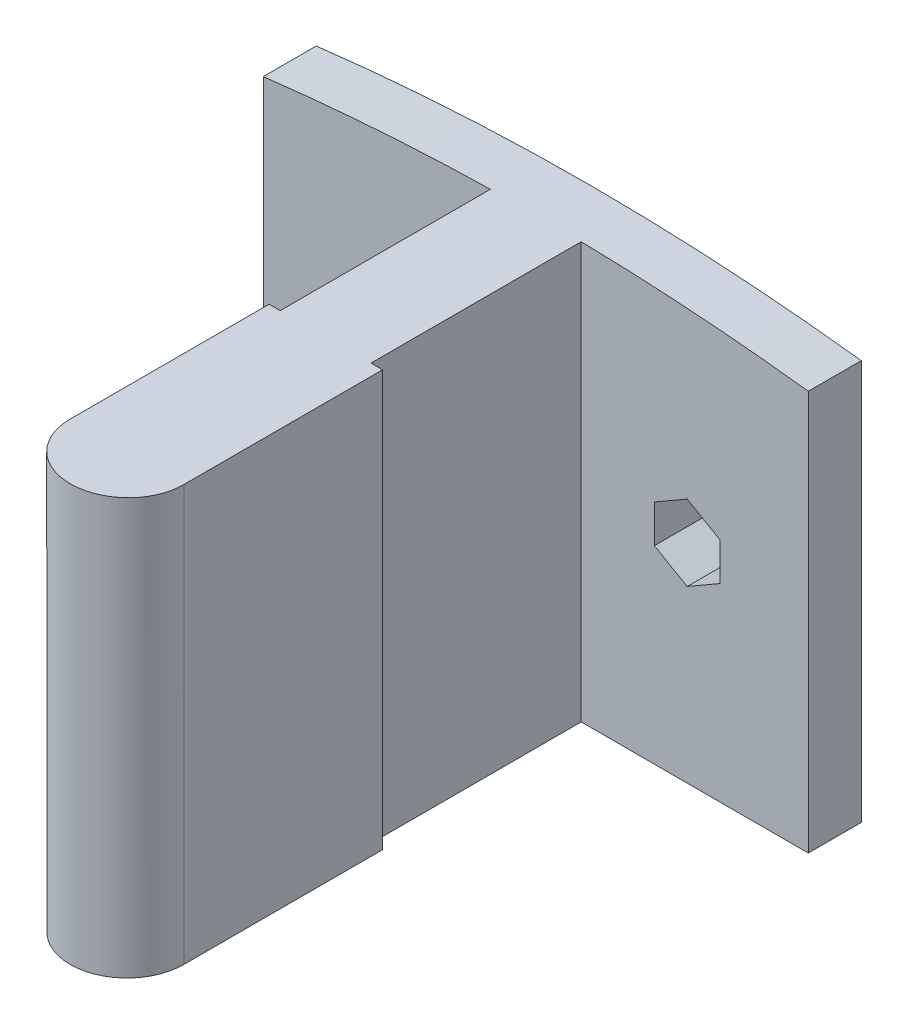
ISO-10303-21;
HEADER;
FILE_DESCRIPTION(('STEP AP214'),'2;1');
FILE_NAME('part.step','',(''),(''),'','','');
FILE_SCHEMA(('AUTOMOTIVE_DESIGN { 1 0 10303 214 1 1 1 1 }'));
ENDSEC;
DATA;
#1=APPLICATION_CONTEXT('core data for automotive mechanical design processes');
#2=APPLICATION_PROTOCOL_DEFINITION('international standard','automotive_design',2000,#1);
#3=PRODUCT_CONTEXT('',#1,'mechanical');
#4=PRODUCT('Part','Part','',(#3));
#5=PRODUCT_RELATED_PRODUCT_CATEGORY('part','',(#4));
#6=PRODUCT_DEFINITION_FORMATION('','',#4);
#7=PRODUCT_DEFINITION_CONTEXT('part definition',#1,'design');
#8=PRODUCT_DEFINITION('design','',#6,#7);
#9=PRODUCT_DEFINITION_SHAPE('','',#8);
#10=(LENGTH_UNIT() NAMED_UNIT(*) SI_UNIT(.MILLI.,.METRE.));
#11=(NAMED_UNIT(*) PLANE_ANGLE_UNIT() SI_UNIT($,.RADIAN.));
#12=(NAMED_UNIT(*) SI_UNIT($,.STERADIAN.) SOLID_ANGLE_UNIT());
#13=UNCERTAINTY_MEASURE_WITH_UNIT(LENGTH_MEASURE(1.E-05),#10,'distance_accuracy_value','');
#14=(GEOMETRIC_REPRESENTATION_CONTEXT(3) GLOBAL_UNCERTAINTY_ASSIGNED_CONTEXT((#13)) GLOBAL_UNIT_ASSIGNED_CONTEXT((#10,
#11,#12)) REPRESENTATION_CONTEXT('',''));
#15=CARTESIAN_POINT('',(0.,0.,0.));
#16=DIRECTION('',(0.,0.,1.));
#17=DIRECTION('',(1.,0.,0.));
#18=AXIS2_PLACEMENT_3D('',#15,#16,#17);
#19=CARTESIAN_POINT('',(-2.5,6.5,-14.));
#20=DIRECTION('',(-0.5,0.866025403784439,0.));
#21=DIRECTION('',(-0.866025403784439,-0.5,0.));
#22=AXIS2_PLACEMENT_3D('',#19,#20,#21);
#23=PLANE('',#22);
#24=DIRECTION('',(0.,0.,1.));
#25=VECTOR('',#24,1.);
#26=CARTESIAN_POINT('',(-2.5,6.5,-14.));
#27=LINE('',#26,#25);
#28=CARTESIAN_POINT('',(-2.5,6.5,-13.7));
#29=VERTEX_POINT('',#28);
#30=CARTESIAN_POINT('',(-2.5,6.5,-12.3));
#31=VERTEX_POINT('',#30);
#32=EDGE_CURVE('E392',#29,#31,#27,.T.);
#33=ORIENTED_EDGE('',*,*,#32,.T.);
#34=DIRECTION('',(-0.866025403784439,-0.5,0.));
#35=VECTOR('',#34,1.);
#36=CARTESIAN_POINT('',(-2.5,6.5,-12.3));
#37=LINE('',#36,#35);
#38=CARTESIAN_POINT('',(-3.36602540378444,6.,-12.3));
#39=VERTEX_POINT('',#38);
#40=EDGE_CURVE('E495',#31,#39,#37,.T.);
#41=ORIENTED_EDGE('',*,*,#40,.T.);
#42=DIRECTION('',(0.,0.,1.));
#43=VECTOR('',#42,1.);
#44=CARTESIAN_POINT('',(-3.36602540378444,6.,-14.));
#45=LINE('',#44,#43);
#46=CARTESIAN_POINT('',(-3.36602540378444,6.,-13.7));
#47=VERTEX_POINT('',#46);
#48=EDGE_CURVE('E395',#47,#39,#45,.T.);
#49=ORIENTED_EDGE('',*,*,#48,.F.);
#50=DIRECTION('',(0.866025403784439,0.5,0.));
#51=VECTOR('',#50,1.);
#52=CARTESIAN_POINT('',(-2.5,6.5,-13.7));
#53=LINE('',#52,#51);
#54=EDGE_CURVE('E499',#47,#29,#53,.T.);
#55=ORIENTED_EDGE('',*,*,#54,.T.);
#56=EDGE_LOOP('',(#33,#41,#49,#55));
#57=FACE_BOUND('',#56,.T.);
#58=ADVANCED_FACE('F75',(#57),#23,.F.);
#59=CARTESIAN_POINT('',(-3.36602540378444,6.,-14.));
#60=DIRECTION('',(-1.,0.,0.));
#61=DIRECTION('',(0.,0.,1.));
#62=AXIS2_PLACEMENT_3D('',#59,#60,#61);
#63=PLANE('',#62);
#64=ORIENTED_EDGE('',*,*,#48,.T.);
#65=DIRECTION('',(0.,-1.,0.));
#66=VECTOR('',#65,1.);
#67=CARTESIAN_POINT('',(-3.36602540378444,6.,-12.3));
#68=LINE('',#67,#66);
#69=CARTESIAN_POINT('',(-3.36602540378444,5.,-12.3));
#70=VERTEX_POINT('',#69);
#71=EDGE_CURVE('E330',#39,#70,#68,.T.);
#72=ORIENTED_EDGE('',*,*,#71,.T.);
#73=DIRECTION('',(0.,0.,1.));
#74=VECTOR('',#73,1.);
#75=CARTESIAN_POINT('',(-3.36602540378444,5.,-14.));
#76=LINE('',#75,#74);
#77=CARTESIAN_POINT('',(-3.36602540378444,5.,-13.7));
#78=VERTEX_POINT('',#77);
#79=EDGE_CURVE('E398',#78,#70,#76,.T.);
#80=ORIENTED_EDGE('',*,*,#79,.F.);
#81=DIRECTION('',(0.,1.,0.));
#82=VECTOR('',#81,1.);
#83=CARTESIAN_POINT('',(-3.36602540378444,6.,-13.7));
#84=LINE('',#83,#82);
#85=EDGE_CURVE('E282',#78,#47,#84,.T.);
#86=ORIENTED_EDGE('',*,*,#85,.T.);
#87=EDGE_LOOP('',(#64,#72,#80,#86));
#88=FACE_BOUND('',#87,.T.);
#89=ADVANCED_FACE('F471',(#88),#63,.F.);
#90=CARTESIAN_POINT('',(-3.36602540378444,5.,-14.));
#91=DIRECTION('',(-0.5,-0.866025403784439,0.));
#92=DIRECTION('',(0.866025403784439,-0.5,0.));
#93=AXIS2_PLACEMENT_3D('',#90,#91,#92);
#94=PLANE('',#93);
#95=ORIENTED_EDGE('',*,*,#79,.T.);
#96=DIRECTION('',(0.866025403784439,-0.5,0.));
#97=VECTOR('',#96,1.);
#98=CARTESIAN_POINT('',(-3.36602540378444,5.,-12.3));
#99=LINE('',#98,#97);
#100=CARTESIAN_POINT('',(-2.5,4.5,-12.3));
#101=VERTEX_POINT('',#100);
#102=EDGE_CURVE('E333',#70,#101,#99,.T.);
#103=ORIENTED_EDGE('',*,*,#102,.T.);
#104=DIRECTION('',(0.,0.,1.));
#105=VECTOR('',#104,1.);
#106=CARTESIAN_POINT('',(-2.5,4.5,-14.));
#107=LINE('',#106,#105);
#108=CARTESIAN_POINT('',(-2.5,4.5,-13.7));
#109=VERTEX_POINT('',#108);
#110=EDGE_CURVE('E401',#109,#101,#107,.T.);
#111=ORIENTED_EDGE('',*,*,#110,.F.);
#112=DIRECTION('',(-0.866025403784439,0.5,0.));
#113=VECTOR('',#112,1.);
#114=CARTESIAN_POINT('',(-3.36602540378444,5.,-13.7));
#115=LINE('',#114,#113);
#116=EDGE_CURVE('E301',#109,#78,#115,.T.);
#117=ORIENTED_EDGE('',*,*,#116,.T.);
#118=EDGE_LOOP('',(#95,#103,#111,#117));
#119=FACE_BOUND('',#118,.T.);
#120=ADVANCED_FACE('F475',(#119),#94,.F.);
#121=CARTESIAN_POINT('',(-2.5,4.5,-14.));
#122=DIRECTION('',(0.5,-0.866025403784439,0.));
#123=DIRECTION('',(0.866025403784439,0.5,0.));
#124=AXIS2_PLACEMENT_3D('',#121,#122,#123);
#125=PLANE('',#124);
#126=ORIENTED_EDGE('',*,*,#110,.T.);
#127=DIRECTION('',(0.866025403784439,0.5,0.));
#128=VECTOR('',#127,1.);
#129=CARTESIAN_POINT('',(-2.5,4.5,-12.3));
#130=LINE('',#129,#128);
#131=CARTESIAN_POINT('',(-1.63397459621556,5.,-12.3));
#132=VERTEX_POINT('',#131);
#133=EDGE_CURVE('E336',#101,#132,#130,.T.);
#134=ORIENTED_EDGE('',*,*,#133,.T.);
#135=DIRECTION('',(0.,0.,1.));
#136=VECTOR('',#135,1.);
#137=CARTESIAN_POINT('',(-1.63397459621556,5.,-14.));
#138=LINE('',#137,#136);
#139=CARTESIAN_POINT('',(-1.63397459621556,5.,-13.7));
#140=VERTEX_POINT('',#139);
#141=EDGE_CURVE('E404',#140,#132,#138,.T.);
#142=ORIENTED_EDGE('',*,*,#141,.F.);
#143=DIRECTION('',(-0.866025403784439,-0.5,0.));
#144=VECTOR('',#143,1.);
#145=CARTESIAN_POINT('',(-2.5,4.5,-13.7));
#146=LINE('',#145,#144);
#147=EDGE_CURVE('E304',#140,#109,#146,.T.);
#148=ORIENTED_EDGE('',*,*,#147,.T.);
#149=EDGE_LOOP('',(#126,#134,#142,#148));
#150=FACE_BOUND('',#149,.T.);
#151=ADVANCED_FACE('F479',(#150),#125,.F.);
#152=CARTESIAN_POINT('',(-1.63397459621556,5.,-14.));
#153=DIRECTION('',(1.,0.,0.));
#154=DIRECTION('',(0.,1.,0.));
#155=AXIS2_PLACEMENT_3D('',#152,#153,#154);
#156=PLANE('',#155);
#157=ORIENTED_EDGE('',*,*,#141,.T.);
#158=DIRECTION('',(0.,1.,0.));
#159=VECTOR('',#158,1.);
#160=CARTESIAN_POINT('',(-1.63397459621556,5.,-12.3));
#161=LINE('',#160,#159);
#162=CARTESIAN_POINT('',(-1.63397459621556,6.,-12.3));
#163=VERTEX_POINT('',#162);
#164=EDGE_CURVE('E339',#132,#163,#161,.T.);
#165=ORIENTED_EDGE('',*,*,#164,.T.);
#166=DIRECTION('',(0.,0.,1.));
#167=VECTOR('',#166,1.);
#168=CARTESIAN_POINT('',(-1.63397459621556,6.,-14.));
#169=LINE('',#168,#167);
#170=CARTESIAN_POINT('',(-1.63397459621556,6.,-13.7));
#171=VERTEX_POINT('',#170);
#172=EDGE_CURVE('E372',#171,#163,#169,.T.);
#173=ORIENTED_EDGE('',*,*,#172,.F.);
#174=DIRECTION('',(0.,-1.,0.));
#175=VECTOR('',#174,1.);
#176=CARTESIAN_POINT('',(-1.63397459621556,5.,-13.7));
#177=LINE('',#176,#175);
#178=EDGE_CURVE('E307',#171,#140,#177,.T.);
#179=ORIENTED_EDGE('',*,*,#178,.T.);
#180=EDGE_LOOP('',(#157,#165,#173,#179));
#181=FACE_BOUND('',#180,.T.);
#182=ADVANCED_FACE('F467',(#181),#156,.F.);
#183=CARTESIAN_POINT('',(-1.63397459621556,6.,-14.));
#184=DIRECTION('',(0.5,0.866025403784439,0.));
#185=DIRECTION('',(-0.866025403784439,0.5,0.));
#186=AXIS2_PLACEMENT_3D('',#183,#184,#185);
#187=PLANE('',#186);
#188=ORIENTED_EDGE('',*,*,#172,.T.);
#189=DIRECTION('',(-0.866025403784439,0.5,0.));
#190=VECTOR('',#189,1.);
#191=CARTESIAN_POINT('',(-1.63397459621556,6.,-12.3));
#192=LINE('',#191,#190);
#193=EDGE_CURVE('E342',#163,#31,#192,.T.);
#194=ORIENTED_EDGE('',*,*,#193,.T.);
#195=ORIENTED_EDGE('',*,*,#32,.F.);
#196=DIRECTION('',(0.866025403784439,-0.5,0.));
#197=VECTOR('',#196,1.);
#198=CARTESIAN_POINT('',(-1.63397459621556,6.,-13.7));
#199=LINE('',#198,#197);
#200=EDGE_CURVE('E310',#29,#171,#199,.T.);
#201=ORIENTED_EDGE('',*,*,#200,.T.);
#202=EDGE_LOOP('',(#188,#194,#195,#201));
#203=FACE_BOUND('',#202,.T.);
#204=ADVANCED_FACE('F464',(#203),#187,.F.);
#205=CARTESIAN_POINT('',(8.7,11.,-12.3));
#206=DIRECTION('',(0.,0.,-1.));
#207=DIRECTION('',(-1.,0.,0.));
#208=AXIS2_PLACEMENT_3D('',#205,#206,#207);
#209=PLANE('',#208);
#210=CARTESIAN_POINT('',(1.5,-49.,-12.3));
#211=DIRECTION('',(0.,0.,-1.));
#212=DIRECTION('',(-1.,0.,0.));
#213=AXIS2_PLACEMENT_3D('',#210,#211,#212);
#214=CIRCLE('',#213,60.);
#215=CARTESIAN_POINT('',(8.7,10.5664335007561,-12.3));
#216=VERTEX_POINT('',#215);
#217=CARTESIAN_POINT('',(2.7,10.9879987997599,-12.3));
#218=VERTEX_POINT('',#217);
#219=EDGE_CURVE('E245',#216,#218,#214,.F.);
#220=ORIENTED_EDGE('',*,*,#219,.T.);
#221=DIRECTION('',(0.,-1.,0.));
#222=VECTOR('',#221,1.);
#223=CARTESIAN_POINT('',(2.7,11.,-12.3));
#224=LINE('',#223,#222);
#225=CARTESIAN_POINT('',(2.7,0.,-12.3));
#226=VERTEX_POINT('',#225);
#227=EDGE_CURVE('E236',#218,#226,#224,.T.);
#228=ORIENTED_EDGE('',*,*,#227,.T.);
#229=DIRECTION('',(1.,0.,0.));
#230=VECTOR('',#229,1.);
#231=CARTESIAN_POINT('',(8.7,0.,-12.3));
#232=LINE('',#231,#230);
#233=CARTESIAN_POINT('',(8.7,0.,-12.3));
#234=VERTEX_POINT('',#233);
#235=EDGE_CURVE('E242',#226,#234,#232,.T.);
#236=ORIENTED_EDGE('',*,*,#235,.T.);
#237=DIRECTION('',(0.,-1.,0.));
#238=VECTOR('',#237,1.);
#239=CARTESIAN_POINT('',(8.7,11.,-12.3));
#240=LINE('',#239,#238);
#241=EDGE_CURVE('E248',#216,#234,#240,.T.);
#242=ORIENTED_EDGE('',*,*,#241,.F.);
#243=EDGE_LOOP('',(#220,#228,#236,#242));
#244=FACE_BOUND('',#243,.T.);
#245=DIRECTION('',(0.,1.,0.));
#246=VECTOR('',#245,1.);
#247=CARTESIAN_POINT('',(6.36602540378444,5.,-12.3));
#248=LINE('',#247,#246);
#249=CARTESIAN_POINT('',(6.36602540378444,5.,-12.3));
#250=VERTEX_POINT('',#249);
#251=CARTESIAN_POINT('',(6.36602540378444,6.,-12.3));
#252=VERTEX_POINT('',#251);
#253=EDGE_CURVE('E356',#250,#252,#248,.T.);
#254=ORIENTED_EDGE('',*,*,#253,.F.);
#255=DIRECTION('',(0.866025403784438,0.500000000000001,0.));
#256=VECTOR('',#255,1.);
#257=CARTESIAN_POINT('',(5.5,4.5,-12.3));
#258=LINE('',#257,#256);
#259=CARTESIAN_POINT('',(5.5,4.5,-12.3));
#260=VERTEX_POINT('',#259);
#261=EDGE_CURVE('E353',#260,#250,#258,.T.);
#262=ORIENTED_EDGE('',*,*,#261,.F.);
#263=DIRECTION('',(0.866025403784438,-0.500000000000001,0.));
#264=VECTOR('',#263,1.);
#265=CARTESIAN_POINT('',(4.63397459621557,5.,-12.3));
#266=LINE('',#265,#264);
#267=CARTESIAN_POINT('',(4.63397459621557,5.,-12.3));
#268=VERTEX_POINT('',#267);
#269=EDGE_CURVE('E350',#268,#260,#266,.T.);
#270=ORIENTED_EDGE('',*,*,#269,.F.);
#271=DIRECTION('',(0.,-1.,0.));
#272=VECTOR('',#271,1.);
#273=CARTESIAN_POINT('',(4.63397459621557,6.,-12.3));
#274=LINE('',#273,#272);
#275=CARTESIAN_POINT('',(4.63397459621557,6.,-12.3));
#276=VERTEX_POINT('',#275);
#277=EDGE_CURVE('E347',#276,#268,#274,.T.);
#278=ORIENTED_EDGE('',*,*,#277,.F.);
#279=DIRECTION('',(-0.866025403784438,-0.500000000000001,0.));
#280=VECTOR('',#279,1.);
#281=CARTESIAN_POINT('',(5.5,6.5,-12.3));
#282=LINE('',#281,#280);
#283=CARTESIAN_POINT('',(5.5,6.5,-12.3));
#284=VERTEX_POINT('',#283);
#285=EDGE_CURVE('E498',#284,#276,#282,.T.);
#286=ORIENTED_EDGE('',*,*,#285,.F.);
#287=DIRECTION('',(-0.866025403784439,0.5,0.));
#288=VECTOR('',#287,1.);
#289=CARTESIAN_POINT('',(6.36602540378444,6.,-12.3));
#290=LINE('',#289,#288);
#291=EDGE_CURVE('E359',#252,#284,#290,.T.);
#292=ORIENTED_EDGE('',*,*,#291,.F.);
#293=EDGE_LOOP('',(#254,#262,#270,#278,#286,#292));
#294=FACE_BOUND('',#293,.T.);
#295=ADVANCED_FACE('F238',(#244,#294),#209,.F.);
#296=CARTESIAN_POINT('',(0.3,11.,-12.3));
#297=DIRECTION('',(0.,0.,-1.));
#298=DIRECTION('',(-1.,0.,0.));
#299=AXIS2_PLACEMENT_3D('',#296,#297,#298);
#300=PLANE('',#299);
#301=CARTESIAN_POINT('',(1.5,-49.,-12.3));
#302=DIRECTION('',(0.,0.,-1.));
#303=DIRECTION('',(-1.,0.,0.));
#304=AXIS2_PLACEMENT_3D('',#301,#302,#303);
#305=CIRCLE('',#304,60.);
#306=CARTESIAN_POINT('',(0.3,10.9879987997599,-12.3));
#307=VERTEX_POINT('',#306);
#308=CARTESIAN_POINT('',(-5.7,10.5664335007561,-12.3));
#309=VERTEX_POINT('',#308);
#310=EDGE_CURVE('E345',#307,#309,#305,.F.);
#311=ORIENTED_EDGE('',*,*,#310,.T.);
#312=DIRECTION('',(0.,-1.,0.));
#313=VECTOR('',#312,1.);
#314=CARTESIAN_POINT('',(-5.7,11.,-12.3));
#315=LINE('',#314,#313);
#316=CARTESIAN_POINT('',(-5.7,0.,-12.3));
#317=VERTEX_POINT('',#316);
#318=EDGE_CURVE('E292',#309,#317,#315,.T.);
#319=ORIENTED_EDGE('',*,*,#318,.T.);
#320=DIRECTION('',(1.,0.,0.));
#321=VECTOR('',#320,1.);
#322=CARTESIAN_POINT('',(0.3,0.,-12.3));
#323=LINE('',#322,#321);
#324=CARTESIAN_POINT('',(0.3,0.,-12.3));
#325=VERTEX_POINT('',#324);
#326=EDGE_CURVE('E272',#317,#325,#323,.T.);
#327=ORIENTED_EDGE('',*,*,#326,.T.);
#328=DIRECTION('',(0.,-1.,0.));
#329=VECTOR('',#328,1.);
#330=CARTESIAN_POINT('',(0.3,11.,-12.3));
#331=LINE('',#330,#329);
#332=EDGE_CURVE('E290',#307,#325,#331,.T.);
#333=ORIENTED_EDGE('',*,*,#332,.F.);
#334=EDGE_LOOP('',(#311,#319,#327,#333));
#335=FACE_BOUND('',#334,.T.);
#336=ORIENTED_EDGE('',*,*,#164,.F.);
#337=ORIENTED_EDGE('',*,*,#133,.F.);
#338=ORIENTED_EDGE('',*,*,#102,.F.);
#339=ORIENTED_EDGE('',*,*,#71,.F.);
#340=ORIENTED_EDGE('',*,*,#40,.F.);
#341=ORIENTED_EDGE('',*,*,#193,.F.);
#342=EDGE_LOOP('',(#336,#337,#338,#339,#340,#341));
#343=FACE_BOUND('',#342,.T.);
#344=ADVANCED_FACE('F491',(#335,#343),#300,.F.);
#345=CARTESIAN_POINT('',(-5.7,11.,-13.7));
#346=DIRECTION('',(0.,0.,1.));
#347=DIRECTION('',(1.,0.,0.));
#348=AXIS2_PLACEMENT_3D('',#345,#346,#347);
#349=PLANE('',#348);
#350=CARTESIAN_POINT('',(1.5,-49.,-13.7));
#351=DIRECTION('',(0.,0.,1.));
#352=DIRECTION('',(1.,0.,0.));
#353=AXIS2_PLACEMENT_3D('',#350,#351,#352);
#354=CIRCLE('',#353,60.);
#355=CARTESIAN_POINT('',(-5.7,10.5664335007561,-13.7));
#356=VERTEX_POINT('',#355);
#357=CARTESIAN_POINT('',(8.7,10.5664335007561,-13.7));
#358=VERTEX_POINT('',#357);
#359=EDGE_CURVE('E328',#356,#358,#354,.F.);
#360=ORIENTED_EDGE('',*,*,#359,.T.);
#361=DIRECTION('',(0.,-1.,0.));
#362=VECTOR('',#361,1.);
#363=CARTESIAN_POINT('',(8.7,11.,-13.7));
#364=LINE('',#363,#362);
#365=CARTESIAN_POINT('',(8.7,0.,-13.7));
#366=VERTEX_POINT('',#365);
#367=EDGE_CURVE('E296',#358,#366,#364,.T.);
#368=ORIENTED_EDGE('',*,*,#367,.T.);
#369=DIRECTION('',(-1.,0.,0.));
#370=VECTOR('',#369,1.);
#371=CARTESIAN_POINT('',(-5.7,0.,-13.7));
#372=LINE('',#371,#370);
#373=CARTESIAN_POINT('',(-5.7,0.,-13.7));
#374=VERTEX_POINT('',#373);
#375=EDGE_CURVE('E264',#366,#374,#372,.T.);
#376=ORIENTED_EDGE('',*,*,#375,.T.);
#377=DIRECTION('',(0.,-1.,0.));
#378=VECTOR('',#377,1.);
#379=CARTESIAN_POINT('',(-5.7,11.,-13.7));
#380=LINE('',#379,#378);
#381=EDGE_CURVE('E294',#356,#374,#380,.T.);
#382=ORIENTED_EDGE('',*,*,#381,.F.);
#383=EDGE_LOOP('',(#360,#368,#376,#382));
#384=FACE_BOUND('',#383,.T.);
#385=ORIENTED_EDGE('',*,*,#54,.F.);
#386=ORIENTED_EDGE('',*,*,#85,.F.);
#387=ORIENTED_EDGE('',*,*,#116,.F.);
#388=ORIENTED_EDGE('',*,*,#147,.F.);
#389=ORIENTED_EDGE('',*,*,#178,.F.);
#390=ORIENTED_EDGE('',*,*,#200,.F.);
#391=EDGE_LOOP('',(#385,#386,#387,#388,#389,#390));
#392=FACE_BOUND('',#391,.T.);
#393=DIRECTION('',(0.866025403784438,0.500000000000001,0.));
#394=VECTOR('',#393,1.);
#395=CARTESIAN_POINT('',(5.5,6.5,-13.7));
#396=LINE('',#395,#394);
#397=CARTESIAN_POINT('',(4.63397459621557,6.,-13.7));
#398=VERTEX_POINT('',#397);
#399=CARTESIAN_POINT('',(5.5,6.5,-13.7));
#400=VERTEX_POINT('',#399);
#401=EDGE_CURVE('E313',#398,#400,#396,.T.);
#402=ORIENTED_EDGE('',*,*,#401,.F.);
#403=DIRECTION('',(0.,1.,0.));
#404=VECTOR('',#403,1.);
#405=CARTESIAN_POINT('',(4.63397459621557,6.,-13.7));
#406=LINE('',#405,#404);
#407=CARTESIAN_POINT('',(4.63397459621557,5.,-13.7));
#408=VERTEX_POINT('',#407);
#409=EDGE_CURVE('E315',#408,#398,#406,.T.);
#410=ORIENTED_EDGE('',*,*,#409,.F.);
#411=DIRECTION('',(-0.866025403784438,0.500000000000001,0.));
#412=VECTOR('',#411,1.);
#413=CARTESIAN_POINT('',(4.63397459621557,5.,-13.7));
#414=LINE('',#413,#412);
#415=CARTESIAN_POINT('',(5.5,4.5,-13.7));
#416=VERTEX_POINT('',#415);
#417=EDGE_CURVE('E318',#416,#408,#414,.T.);
#418=ORIENTED_EDGE('',*,*,#417,.F.);
#419=DIRECTION('',(-0.866025403784438,-0.500000000000001,0.));
#420=VECTOR('',#419,1.);
#421=CARTESIAN_POINT('',(5.5,4.5,-13.7));
#422=LINE('',#421,#420);
#423=CARTESIAN_POINT('',(6.36602540378444,5.,-13.7));
#424=VERTEX_POINT('',#423);
#425=EDGE_CURVE('E321',#424,#416,#422,.T.);
#426=ORIENTED_EDGE('',*,*,#425,.F.);
#427=DIRECTION('',(0.,-1.,0.));
#428=VECTOR('',#427,1.);
#429=CARTESIAN_POINT('',(6.36602540378444,5.,-13.7));
#430=LINE('',#429,#428);
#431=CARTESIAN_POINT('',(6.36602540378444,6.,-13.7));
#432=VERTEX_POINT('',#431);
#433=EDGE_CURVE('E324',#432,#424,#430,.T.);
#434=ORIENTED_EDGE('',*,*,#433,.F.);
#435=DIRECTION('',(0.866025403784439,-0.5,0.));
#436=VECTOR('',#435,1.);
#437=CARTESIAN_POINT('',(6.36602540378444,6.,-13.7));
#438=LINE('',#437,#436);
#439=EDGE_CURVE('E98',#400,#432,#438,.T.);
#440=ORIENTED_EDGE('',*,*,#439,.F.);
#441=EDGE_LOOP('',(#402,#410,#418,#426,#434,#440));
#442=FACE_BOUND('',#441,.T.);
#443=ADVANCED_FACE('F516',(#384,#392,#442),#349,.F.);
#444=CARTESIAN_POINT('',(2.7,11.,-12.3));
#445=DIRECTION('',(-1.,0.,0.));
#446=DIRECTION('',(0.,0.,1.));
#447=AXIS2_PLACEMENT_3D('',#444,#445,#446);
#448=PLANE('',#447);
#449=DIRECTION('',(0.,0.,-1.));
#450=VECTOR('',#449,1.);
#451=CARTESIAN_POINT('',(2.7,10.9879987997599,0.));
#452=LINE('',#451,#450);
#453=CARTESIAN_POINT('',(2.7,10.9879987997599,-6.75));
#454=VERTEX_POINT('',#453);
#455=EDGE_CURVE('E506',#218,#454,#452,.F.);
#456=ORIENTED_EDGE('',*,*,#455,.T.);
#457=DIRECTION('',(0.,-1.,0.));
#458=VECTOR('',#457,1.);
#459=CARTESIAN_POINT('',(2.7,11.,-6.75));
#460=LINE('',#459,#458);
#461=CARTESIAN_POINT('',(2.7,0.,-6.75));
#462=VERTEX_POINT('',#461);
#463=EDGE_CURVE('E254',#454,#462,#460,.T.);
#464=ORIENTED_EDGE('',*,*,#463,.T.);
#465=DIRECTION('',(0.,0.,-1.));
#466=VECTOR('',#465,1.);
#467=CARTESIAN_POINT('',(2.7,0.,-12.3));
#468=LINE('',#467,#466);
#469=EDGE_CURVE('E252',#462,#226,#468,.T.);
#470=ORIENTED_EDGE('',*,*,#469,.T.);
#471=ORIENTED_EDGE('',*,*,#227,.F.);
#472=EDGE_LOOP('',(#456,#464,#470,#471));
#473=FACE_BOUND('',#472,.T.);
#474=ADVANCED_FACE('F253',(#473),#448,.F.);
#475=CARTESIAN_POINT('',(3.,11.,-6.75));
#476=DIRECTION('',(0.,0.,1.));
#477=DIRECTION('',(1.,0.,0.));
#478=AXIS2_PLACEMENT_3D('',#475,#476,#477);
#479=PLANE('',#478);
#480=CARTESIAN_POINT('',(1.5,-49.,-6.75000000000001));
#481=DIRECTION('',(0.,0.,1.));
#482=DIRECTION('',(1.,0.,0.));
#483=AXIS2_PLACEMENT_3D('',#480,#481,#482);
#484=CIRCLE('',#483,60.);
#485=CARTESIAN_POINT('',(3.,10.9812470693966,-6.75));
#486=VERTEX_POINT('',#485);
#487=EDGE_CURVE('E90',#454,#486,#484,.F.);
#488=ORIENTED_EDGE('',*,*,#487,.T.);
#489=DIRECTION('',(0.,-1.,0.));
#490=VECTOR('',#489,1.);
#491=CARTESIAN_POINT('',(3.,11.,-6.75));
#492=LINE('',#491,#490);
#493=CARTESIAN_POINT('',(3.,0.,-6.75));
#494=VERTEX_POINT('',#493);
#495=EDGE_CURVE('E283',#486,#494,#492,.T.);
#496=ORIENTED_EDGE('',*,*,#495,.T.);
#497=DIRECTION('',(-1.,0.,0.));
#498=VECTOR('',#497,1.);
#499=CARTESIAN_POINT('',(3.,0.,-6.75));
#500=LINE('',#499,#498);
#501=EDGE_CURVE('E249',#494,#462,#500,.T.);
#502=ORIENTED_EDGE('',*,*,#501,.T.);
#503=ORIENTED_EDGE('',*,*,#463,.F.);
#504=EDGE_LOOP('',(#488,#496,#502,#503));
#505=FACE_BOUND('',#504,.T.);
#506=ADVANCED_FACE('F545',(#505),#479,.F.);
#507=CARTESIAN_POINT('',(0.3,11.,-6.75));
#508=DIRECTION('',(0.,0.,1.));
#509=DIRECTION('',(1.,0.,0.));
#510=AXIS2_PLACEMENT_3D('',#507,#508,#509);
#511=PLANE('',#510);
#512=CARTESIAN_POINT('',(1.5,-49.,-6.75));
#513=DIRECTION('',(0.,0.,1.));
#514=DIRECTION('',(1.,0.,0.));
#515=AXIS2_PLACEMENT_3D('',#512,#513,#514);
#516=CIRCLE('',#515,60.);
#517=CARTESIAN_POINT('',(0.,10.9812470693966,-6.75));
#518=VERTEX_POINT('',#517);
#519=CARTESIAN_POINT('',(0.3,10.9879987997599,-6.75));
#520=VERTEX_POINT('',#519);
#521=EDGE_CURVE('E364',#518,#520,#516,.F.);
#522=ORIENTED_EDGE('',*,*,#521,.T.);
#523=DIRECTION('',(0.,-1.,0.));
#524=VECTOR('',#523,1.);
#525=CARTESIAN_POINT('',(0.3,11.,-6.75));
#526=LINE('',#525,#524);
#527=CARTESIAN_POINT('',(0.3,0.,-6.75));
#528=VERTEX_POINT('',#527);
#529=EDGE_CURVE('E288',#520,#528,#526,.T.);
#530=ORIENTED_EDGE('',*,*,#529,.T.);
#531=DIRECTION('',(-1.,0.,0.));
#532=VECTOR('',#531,1.);
#533=CARTESIAN_POINT('',(0.3,0.,-6.75));
#534=LINE('',#533,#532);
#535=CARTESIAN_POINT('',(0.,0.,-6.75));
#536=VERTEX_POINT('',#535);
#537=EDGE_CURVE('E278',#528,#536,#534,.T.);
#538=ORIENTED_EDGE('',*,*,#537,.T.);
#539=DIRECTION('',(0.,-1.,0.));
#540=VECTOR('',#539,1.);
#541=CARTESIAN_POINT('',(0.,11.,-6.75));
#542=LINE('',#541,#540);
#543=EDGE_CURVE('E285',#518,#536,#542,.T.);
#544=ORIENTED_EDGE('',*,*,#543,.F.);
#545=EDGE_LOOP('',(#522,#530,#538,#544));
#546=FACE_BOUND('',#545,.T.);
#547=ADVANCED_FACE('F534',(#546),#511,.F.);
#548=CARTESIAN_POINT('',(0.3,11.,-6.75));
#549=DIRECTION('',(1.,0.,0.));
#550=DIRECTION('',(0.,0.,-1.));
#551=AXIS2_PLACEMENT_3D('',#548,#549,#550);
#552=PLANE('',#551);
#553=DIRECTION('',(0.,0.,-1.));
#554=VECTOR('',#553,1.);
#555=CARTESIAN_POINT('',(0.3,10.9879987997599,0.));
#556=LINE('',#555,#554);
#557=EDGE_CURVE('E12',#520,#307,#556,.T.);
#558=ORIENTED_EDGE('',*,*,#557,.T.);
#559=ORIENTED_EDGE('',*,*,#332,.T.);
#560=DIRECTION('',(0.,0.,1.));
#561=VECTOR('',#560,1.);
#562=CARTESIAN_POINT('',(0.3,0.,-6.75));
#563=LINE('',#562,#561);
#564=EDGE_CURVE('E275',#325,#528,#563,.T.);
#565=ORIENTED_EDGE('',*,*,#564,.T.);
#566=ORIENTED_EDGE('',*,*,#529,.F.);
#567=EDGE_LOOP('',(#558,#559,#565,#566));
#568=FACE_BOUND('',#567,.T.);
#569=ADVANCED_FACE('F532',(#568),#552,.F.);
#570=CARTESIAN_POINT('',(-5.7,11.,-12.3));
#571=DIRECTION('',(1.,0.,0.));
#572=DIRECTION('',(0.,0.,-1.));
#573=AXIS2_PLACEMENT_3D('',#570,#571,#572);
#574=PLANE('',#573);
#575=DIRECTION('',(0.,0.,-1.));
#576=VECTOR('',#575,1.);
#577=CARTESIAN_POINT('',(-5.7,10.5664335007561,0.));
#578=LINE('',#577,#576);
#579=EDGE_CURVE('E83',#309,#356,#578,.T.);
#580=ORIENTED_EDGE('',*,*,#579,.T.);
#581=ORIENTED_EDGE('',*,*,#381,.T.);
#582=DIRECTION('',(0.,0.,1.));
#583=VECTOR('',#582,1.);
#584=CARTESIAN_POINT('',(-5.7,0.,-12.3));
#585=LINE('',#584,#583);
#586=EDGE_CURVE('E269',#374,#317,#585,.T.);
#587=ORIENTED_EDGE('',*,*,#586,.T.);
#588=ORIENTED_EDGE('',*,*,#318,.F.);
#589=EDGE_LOOP('',(#580,#581,#587,#588));
#590=FACE_BOUND('',#589,.T.);
#591=ADVANCED_FACE('F511',(#590),#574,.F.);
#592=CARTESIAN_POINT('',(8.7,11.,-13.7));
#593=DIRECTION('',(-1.,0.,0.));
#594=DIRECTION('',(0.,0.,1.));
#595=AXIS2_PLACEMENT_3D('',#592,#593,#594);
#596=PLANE('',#595);
#597=DIRECTION('',(0.,0.,-1.));
#598=VECTOR('',#597,1.);
#599=CARTESIAN_POINT('',(8.7,10.5664335007561,0.));
#600=LINE('',#599,#598);
#601=EDGE_CURVE('E502',#358,#216,#600,.F.);
#602=ORIENTED_EDGE('',*,*,#601,.T.);
#603=ORIENTED_EDGE('',*,*,#241,.T.);
#604=DIRECTION('',(0.,0.,-1.));
#605=VECTOR('',#604,1.);
#606=CARTESIAN_POINT('',(8.7,0.,-13.7));
#607=LINE('',#606,#605);
#608=EDGE_CURVE('E262',#234,#366,#607,.T.);
#609=ORIENTED_EDGE('',*,*,#608,.T.);
#610=ORIENTED_EDGE('',*,*,#367,.F.);
#611=EDGE_LOOP('',(#602,#603,#609,#610));
#612=FACE_BOUND('',#611,.T.);
#613=ADVANCED_FACE('F459',(#612),#596,.F.);
#614=CARTESIAN_POINT('',(5.5,6.5,-14.));
#615=DIRECTION('',(-0.500000000000001,0.866025403784438,0.));
#616=DIRECTION('',(-0.866025403784438,-0.500000000000001,0.));
#617=AXIS2_PLACEMENT_3D('',#614,#615,#616);
#618=PLANE('',#617);
#619=DIRECTION('',(0.,0.,1.));
#620=VECTOR('',#619,1.);
#621=CARTESIAN_POINT('',(4.63397459621557,6.,-14.));
#622=LINE('',#621,#620);
#623=EDGE_CURVE('E386',#398,#276,#622,.T.);
#624=ORIENTED_EDGE('',*,*,#623,.F.);
#625=ORIENTED_EDGE('',*,*,#401,.T.);
#626=DIRECTION('',(0.,0.,1.));
#627=VECTOR('',#626,1.);
#628=CARTESIAN_POINT('',(5.5,6.5,-14.));
#629=LINE('',#628,#627);
#630=EDGE_CURVE('E389',#400,#284,#629,.T.);
#631=ORIENTED_EDGE('',*,*,#630,.T.);
#632=ORIENTED_EDGE('',*,*,#285,.T.);
#633=EDGE_LOOP('',(#624,#625,#631,#632));
#634=FACE_BOUND('',#633,.T.);
#635=ADVANCED_FACE('F455',(#634),#618,.F.);
#636=CARTESIAN_POINT('',(4.63397459621557,6.,-14.));
#637=DIRECTION('',(-1.,0.,0.));
#638=DIRECTION('',(0.,0.,1.));
#639=AXIS2_PLACEMENT_3D('',#636,#637,#638);
#640=PLANE('',#639);
#641=DIRECTION('',(0.,0.,1.));
#642=VECTOR('',#641,1.);
#643=CARTESIAN_POINT('',(4.63397459621557,5.,-14.));
#644=LINE('',#643,#642);
#645=EDGE_CURVE('E383',#408,#268,#644,.T.);
#646=ORIENTED_EDGE('',*,*,#645,.F.);
#647=ORIENTED_EDGE('',*,*,#409,.T.);
#648=ORIENTED_EDGE('',*,*,#623,.T.);
#649=ORIENTED_EDGE('',*,*,#277,.T.);
#650=EDGE_LOOP('',(#646,#647,#648,#649));
#651=FACE_BOUND('',#650,.T.);
#652=ADVANCED_FACE('F451',(#651),#640,.F.);
#653=CARTESIAN_POINT('',(4.63397459621557,5.,-14.));
#654=DIRECTION('',(-0.500000000000001,-0.866025403784438,0.));
#655=DIRECTION('',(0.866025403784438,-0.500000000000001,0.));
#656=AXIS2_PLACEMENT_3D('',#653,#654,#655);
#657=PLANE('',#656);
#658=DIRECTION('',(0.,0.,1.));
#659=VECTOR('',#658,1.);
#660=CARTESIAN_POINT('',(5.5,4.5,-14.));
#661=LINE('',#660,#659);
#662=EDGE_CURVE('E380',#416,#260,#661,.T.);
#663=ORIENTED_EDGE('',*,*,#662,.F.);
#664=ORIENTED_EDGE('',*,*,#417,.T.);
#665=ORIENTED_EDGE('',*,*,#645,.T.);
#666=ORIENTED_EDGE('',*,*,#269,.T.);
#667=EDGE_LOOP('',(#663,#664,#665,#666));
#668=FACE_BOUND('',#667,.T.);
#669=ADVANCED_FACE('F447',(#668),#657,.F.);
#670=CARTESIAN_POINT('',(5.5,4.5,-14.));
#671=DIRECTION('',(0.500000000000001,-0.866025403784438,0.));
#672=DIRECTION('',(0.866025403784438,0.500000000000001,0.));
#673=AXIS2_PLACEMENT_3D('',#670,#671,#672);
#674=PLANE('',#673);
#675=DIRECTION('',(0.,0.,1.));
#676=VECTOR('',#675,1.);
#677=CARTESIAN_POINT('',(6.36602540378444,5.,-14.));
#678=LINE('',#677,#676);
#679=EDGE_CURVE('E377',#424,#250,#678,.T.);
#680=ORIENTED_EDGE('',*,*,#679,.F.);
#681=ORIENTED_EDGE('',*,*,#425,.T.);
#682=ORIENTED_EDGE('',*,*,#662,.T.);
#683=ORIENTED_EDGE('',*,*,#261,.T.);
#684=EDGE_LOOP('',(#680,#681,#682,#683));
#685=FACE_BOUND('',#684,.T.);
#686=ADVANCED_FACE('F443',(#685),#674,.F.);
#687=CARTESIAN_POINT('',(6.36602540378444,5.,-14.));
#688=DIRECTION('',(1.,0.,0.));
#689=DIRECTION('',(0.,0.,-1.));
#690=AXIS2_PLACEMENT_3D('',#687,#688,#689);
#691=PLANE('',#690);
#692=DIRECTION('',(0.,0.,1.));
#693=VECTOR('',#692,1.);
#694=CARTESIAN_POINT('',(6.36602540378444,6.,-14.));
#695=LINE('',#694,#693);
#696=EDGE_CURVE('E373',#432,#252,#695,.T.);
#697=ORIENTED_EDGE('',*,*,#696,.F.);
#698=ORIENTED_EDGE('',*,*,#433,.T.);
#699=ORIENTED_EDGE('',*,*,#679,.T.);
#700=ORIENTED_EDGE('',*,*,#253,.T.);
#701=EDGE_LOOP('',(#697,#698,#699,#700));
#702=FACE_BOUND('',#701,.T.);
#703=ADVANCED_FACE('F439',(#702),#691,.F.);
#704=CARTESIAN_POINT('',(6.36602540378444,6.,-14.));
#705=DIRECTION('',(0.5,0.866025403784438,0.));
#706=DIRECTION('',(-0.866025403784439,0.5,0.));
#707=AXIS2_PLACEMENT_3D('',#704,#705,#706);
#708=PLANE('',#707);
#709=ORIENTED_EDGE('',*,*,#630,.F.);
#710=ORIENTED_EDGE('',*,*,#439,.T.);
#711=ORIENTED_EDGE('',*,*,#696,.T.);
#712=ORIENTED_EDGE('',*,*,#291,.T.);
#713=EDGE_LOOP('',(#709,#710,#711,#712));
#714=FACE_BOUND('',#713,.T.);
#715=ADVANCED_FACE('F442',(#714),#708,.F.);
#716=CARTESIAN_POINT('',(0.,0.,0.));
#717=DIRECTION('',(0.,-1.,0.));
#718=DIRECTION('',(0.,0.,-1.));
#719=AXIS2_PLACEMENT_3D('',#716,#717,#718);
#720=PLANE('',#719);
#721=ORIENTED_EDGE('',*,*,#501,.F.);
#722=DIRECTION('',(0.,0.,-1.));
#723=VECTOR('',#722,1.);
#724=CARTESIAN_POINT('',(3.,0.,-12.));
#725=LINE('',#724,#723);
#726=CARTESIAN_POINT('',(3.,0.,-1.5));
#727=VERTEX_POINT('',#726);
#728=EDGE_CURVE('E413',#727,#494,#725,.T.);
#729=ORIENTED_EDGE('',*,*,#728,.F.);
#730=CARTESIAN_POINT('',(1.5,0.,-1.5));
#731=DIRECTION('',(0.,-1.,0.));
#732=DIRECTION('',(0.,0.,-1.));
#733=AXIS2_PLACEMENT_3D('',#730,#731,#732);
#734=CIRCLE('',#733,1.5);
#735=CARTESIAN_POINT('',(0.,0.,-1.5));
#736=VERTEX_POINT('',#735);
#737=EDGE_CURVE('E366',#727,#736,#734,.T.);
#738=ORIENTED_EDGE('',*,*,#737,.T.);
#739=DIRECTION('',(0.,0.,1.));
#740=VECTOR('',#739,1.);
#741=CARTESIAN_POINT('',(0.,0.,0.));
#742=LINE('',#741,#740);
#743=EDGE_CURVE('E416',#536,#736,#742,.T.);
#744=ORIENTED_EDGE('',*,*,#743,.F.);
#745=ORIENTED_EDGE('',*,*,#537,.F.);
#746=ORIENTED_EDGE('',*,*,#564,.F.);
#747=ORIENTED_EDGE('',*,*,#326,.F.);
#748=ORIENTED_EDGE('',*,*,#586,.F.);
#749=ORIENTED_EDGE('',*,*,#375,.F.);
#750=ORIENTED_EDGE('',*,*,#608,.F.);
#751=ORIENTED_EDGE('',*,*,#235,.F.);
#752=ORIENTED_EDGE('',*,*,#469,.F.);
#753=EDGE_LOOP('',(#721,#729,#738,#744,#745,#746,#747,#748,#749,#750,#751,#752));
#754=FACE_BOUND('',#753,.T.);
#755=ADVANCED_FACE('F259',(#754),#720,.T.);
#756=CARTESIAN_POINT('',(1.5,-49.,0.));
#757=DIRECTION('',(0.,0.,-1.));
#758=DIRECTION('',(-1.,0.,0.));
#759=AXIS2_PLACEMENT_3D('',#756,#757,#758);
#760=CYLINDRICAL_SURFACE('',#759,60.);
#761=ORIENTED_EDGE('',*,*,#521,.F.);
#762=DIRECTION('',(0.,0.,-1.));
#763=VECTOR('',#762,1.);
#764=CARTESIAN_POINT('',(0.,10.9812470693966,0.));
#765=LINE('',#764,#763);
#766=CARTESIAN_POINT('',(0.,10.9812470693966,-1.5));
#767=VERTEX_POINT('',#766);
#768=EDGE_CURVE('E376',#518,#767,#765,.F.);
#769=ORIENTED_EDGE('',*,*,#768,.T.);
#770=CARTESIAN_POINT('',(0.,10.9812470693966,-1.5));
#771=CARTESIAN_POINT('',(2.73480726317659E-07,10.9812468196587,-1.45780614107603));
#772=CARTESIAN_POINT('',(0.00178143900273118,10.9812916481184,-1.41563250358184));
#773=CARTESIAN_POINT('',(0.00888718378137117,10.981468814954,-1.33158712334317));
#774=CARTESIAN_POINT('',(0.0142115893481467,10.9816011490404,-1.2897153659022));
#775=CARTESIAN_POINT('',(0.0354496688439356,10.9821248872167,-1.16507210086902));
#776=CARTESIAN_POINT('',(0.0566283416893381,10.9826430438026,-1.08313575196598));
#777=CARTESIAN_POINT('',(0.112436943193755,10.9839598447922,-0.923985277642969));
#778=CARTESIAN_POINT('',(0.147073287453543,10.9847586229575,-0.846773424857086));
#779=CARTESIAN_POINT('',(0.228807341181208,10.9865462697741,-0.699267315991812));
#780=CARTESIAN_POINT('',(0.275902108474003,10.9875350935292,-0.628971432010846));
#781=CARTESIAN_POINT('',(0.381225565018898,10.9895916817844,-0.497275846238861));
#782=CARTESIAN_POINT('',(0.4394556355677,10.990659456068,-0.435877249788923));
#783=CARTESIAN_POINT('',(0.565421832288234,10.9927539229286,-0.323701789419164));
#784=CARTESIAN_POINT('',(0.633161578775617,10.9937805996677,-0.272928989141279));
#785=CARTESIAN_POINT('',(0.776235713623611,10.9956771998577,-0.183454877913649));
#786=CARTESIAN_POINT('',(0.851574049888595,10.9965470411627,-0.144759885273472));
#787=CARTESIAN_POINT('',(1.00762165175846,10.9980301930308,-0.0806112063286951));
#788=CARTESIAN_POINT('',(1.08832455947494,10.9986438012031,-0.0551421499656639));
#789=CARTESIAN_POINT('',(1.22456106786914,10.9993922314302,-0.0244638098314467));
#790=CARTESIAN_POINT('',(1.27923682062233,10.9996190796419,-0.0153021748682049));
#791=CARTESIAN_POINT('',(1.38926701070789,10.9999230456941,-0.00306902694808503));
#792=CARTESIAN_POINT('',(1.44462146208579,11.0000001604306,2.35975765488302E-06));
#793=CARTESIAN_POINT('',(1.58424916681071,10.9999997559317,-3.58997589441943E-06));
#794=CARTESIAN_POINT('',(1.66855408076386,10.9998206621656,-0.00712121991113036));
#795=CARTESIAN_POINT('',(1.83483413231469,10.9991235013113,-0.0354135933456866));
#796=CARTESIAN_POINT('',(1.91680664078093,10.9986050663679,-0.0566035920476229));
#797=CARTESIAN_POINT('',(2.07599869568619,10.9972879365351,-0.112435869910829));
#798=CARTESIAN_POINT('',(2.15322035802159,10.9964893674875,-0.147072109498931));
#799=CARTESIAN_POINT('',(2.30073465228892,10.9947020376547,-0.22880616544931));
#800=CARTESIAN_POINT('',(2.37102871288148,10.9937133162087,-0.275901405013478));
#801=CARTESIAN_POINT('',(2.50273317822326,10.991656693555,-0.381233601880283));
#802=CARTESIAN_POINT('',(2.56414125319261,10.9905887716926,-0.439473471885779));
#803=CARTESIAN_POINT('',(2.67631407375526,10.9884942383498,-0.565442588063171));
#804=CARTESIAN_POINT('',(2.72707799925567,10.9874676300572,-0.63317256474299));
#805=CARTESIAN_POINT('',(2.81653050524167,10.9855712402715,-0.776212529407159));
#806=CARTESIAN_POINT('',(2.85521484109549,10.9847015139501,-0.851525169588468));
#807=CARTESIAN_POINT('',(2.91937240611821,10.9832178049506,-1.00756921799339));
#808=CARTESIAN_POINT('',(2.94485246576902,10.9826036900789,-1.08829780012674));
#809=CARTESIAN_POINT('',(2.97554496586131,10.9818548789859,-1.22460191188234));
#810=CARTESIAN_POINT('',(2.98471036396832,10.9816280157876,-1.27931951667741));
#811=CARTESIAN_POINT('',(2.99693689983063,10.9813236811035,-1.38935045223903));
#812=CARTESIAN_POINT('',(3.00000708295472,10.9812459882528,-1.44466277759381));
#813=CARTESIAN_POINT('',(3.,10.9812470693966,-1.5));
#814=B_SPLINE_CURVE_WITH_KNOTS('',3,(#770,#771,#772,#773,#774,#775,#776,#777,#778,#779,#780,
#781,#782,#783,#784,#785,#786,#787,#788,#789,#790,#791,#792,#793,#794,#795,#796,#797,#798,#799,
#800,#801,#802,#803,#804,#805,#806,#807,#808,#809,#810,#811,#812,#813),.UNSPECIFIED.,.F.,.F.,(4,
2,2,2,2,2,2,2,2,2,2,2,2,2,2,2,2,2,2,2,2,4),(0.,0.12650380681665,0.253001412865135,
0.505591305781583,0.758301762509365,1.01095259245451,1.26363478323429,1.51641343183412,
1.76932409671499,2.02194018885763,2.18793989626261,2.35394304481349,2.6064890216508,
2.85930921974642,3.11201599114355,3.36467053796899,3.61739120768771,3.87013134146332,
4.12296018559629,4.37565811221273,4.54178287977825,4.7076609314538),.UNSPECIFIED.);
#815=CARTESIAN_POINT('',(3.,10.9812470693966,-1.5));
#816=VERTEX_POINT('',#815);
#817=EDGE_CURVE('E418',#767,#816,#814,.T.);
#818=ORIENTED_EDGE('',*,*,#817,.T.);
#819=DIRECTION('',(0.,0.,-1.));
#820=VECTOR('',#819,1.);
#821=CARTESIAN_POINT('',(3.,10.9812470693966,0.));
#822=LINE('',#821,#820);
#823=EDGE_CURVE('E410',#816,#486,#822,.T.);
#824=ORIENTED_EDGE('',*,*,#823,.T.);
#825=ORIENTED_EDGE('',*,*,#487,.F.);
#826=ORIENTED_EDGE('',*,*,#455,.F.);
#827=ORIENTED_EDGE('',*,*,#219,.F.);
#828=ORIENTED_EDGE('',*,*,#601,.F.);
#829=ORIENTED_EDGE('',*,*,#359,.F.);
#830=ORIENTED_EDGE('',*,*,#579,.F.);
#831=ORIENTED_EDGE('',*,*,#310,.F.);
#832=ORIENTED_EDGE('',*,*,#557,.F.);
#833=EDGE_LOOP('',(#761,#769,#818,#824,#825,#826,#827,#828,#829,#830,#831,#832));
#834=FACE_BOUND('',#833,.T.);
#835=ADVANCED_FACE('F428',(#834),#760,.T.);
#836=CARTESIAN_POINT('',(0.,11.,0.));
#837=DIRECTION('',(1.,0.,0.));
#838=DIRECTION('',(0.,0.,-1.));
#839=AXIS2_PLACEMENT_3D('',#836,#837,#838);
#840=PLANE('',#839);
#841=ORIENTED_EDGE('',*,*,#768,.F.);
#842=ORIENTED_EDGE('',*,*,#543,.T.);
#843=ORIENTED_EDGE('',*,*,#743,.T.);
#844=DIRECTION('',(0.,-1.,0.));
#845=VECTOR('',#844,1.);
#846=CARTESIAN_POINT('',(0.,11.,-1.5));
#847=LINE('',#846,#845);
#848=EDGE_CURVE('E369',#767,#736,#847,.T.);
#849=ORIENTED_EDGE('',*,*,#848,.F.);
#850=EDGE_LOOP('',(#841,#842,#843,#849));
#851=FACE_BOUND('',#850,.T.);
#852=ADVANCED_FACE('F537',(#851),#840,.F.);
#853=CARTESIAN_POINT('',(3.,11.,-12.));
#854=DIRECTION('',(-1.,0.,0.));
#855=DIRECTION('',(0.,0.,1.));
#856=AXIS2_PLACEMENT_3D('',#853,#854,#855);
#857=PLANE('',#856);
#858=ORIENTED_EDGE('',*,*,#728,.T.);
#859=ORIENTED_EDGE('',*,*,#495,.F.);
#860=ORIENTED_EDGE('',*,*,#823,.F.);
#861=DIRECTION('',(0.,-1.,0.));
#862=VECTOR('',#861,1.);
#863=CARTESIAN_POINT('',(3.,11.,-1.5));
#864=LINE('',#863,#862);
#865=EDGE_CURVE('E426',#816,#727,#864,.T.);
#866=ORIENTED_EDGE('',*,*,#865,.T.);
#867=EDGE_LOOP('',(#858,#859,#860,#866));
#868=FACE_BOUND('',#867,.T.);
#869=ADVANCED_FACE('F77',(#868),#857,.F.);
#870=CARTESIAN_POINT('',(1.5,11.,-1.5));
#871=DIRECTION('',(0.,-1.,0.));
#872=DIRECTION('',(0.,0.,-1.));
#873=AXIS2_PLACEMENT_3D('',#870,#871,#872);
#874=CYLINDRICAL_SURFACE('',#873,1.5);
#875=ORIENTED_EDGE('',*,*,#848,.T.);
#876=ORIENTED_EDGE('',*,*,#737,.F.);
#877=ORIENTED_EDGE('',*,*,#865,.F.);
#878=ORIENTED_EDGE('',*,*,#817,.F.);
#879=EDGE_LOOP('',(#875,#876,#877,#878));
#880=FACE_BOUND('',#879,.T.);
#881=ADVANCED_FACE('F432',(#880),#874,.T.);
#882=CLOSED_SHELL('',(#58,#89,#120,#151,#182,#204,#295,#344,#443,#474,#506,#547,#569,#591,#613,
#635,#652,#669,#686,#703,#715,#755,#835,#852,#869,#881));
#883=MANIFOLD_SOLID_BREP('B2',#882);
#884=ADVANCED_BREP_SHAPE_REPRESENTATION('',(#18,#883),#14);
#885=SHAPE_DEFINITION_REPRESENTATION(#9,#884);
ENDSEC;
END-ISO-10303-21;
